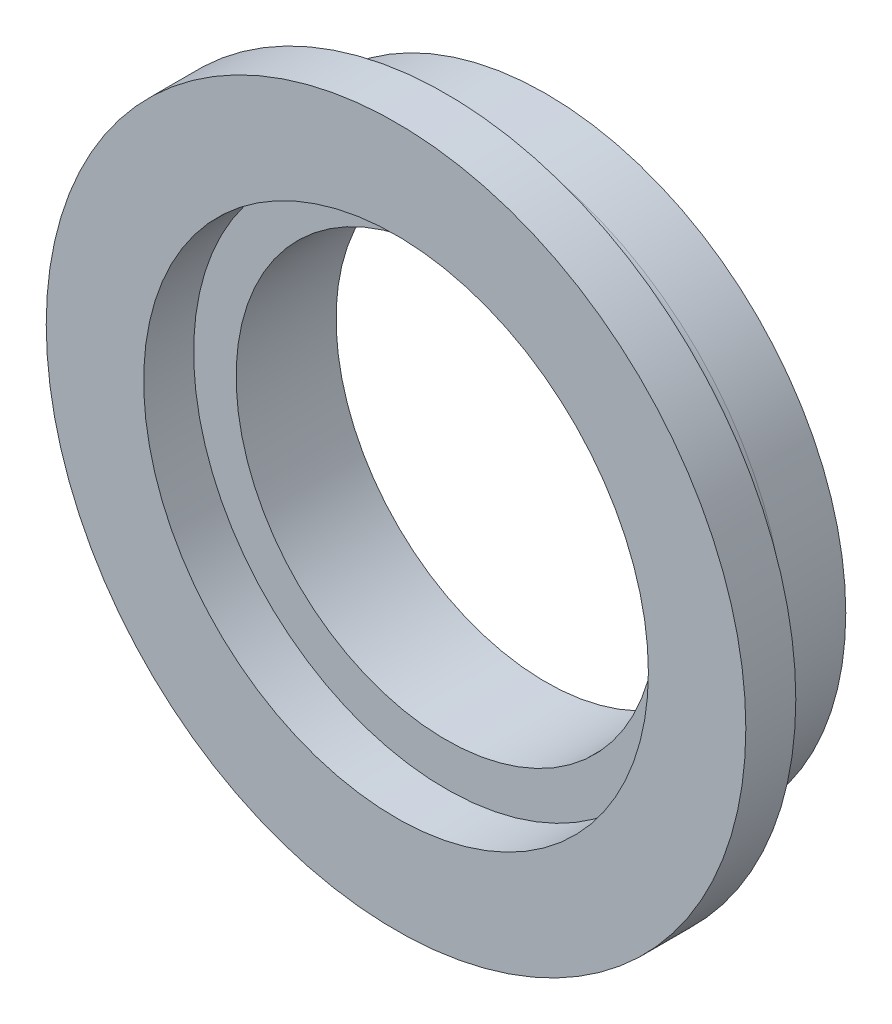
ISO-10303-21;
HEADER;
FILE_DESCRIPTION(('STEP AP214'),'2;1');
FILE_NAME('part.step','',(''),(''),'','','');
FILE_SCHEMA(('AUTOMOTIVE_DESIGN { 1 0 10303 214 1 1 1 1 }'));
ENDSEC;
DATA;
#1=APPLICATION_CONTEXT('core data for automotive mechanical design processes');
#2=APPLICATION_PROTOCOL_DEFINITION('international standard','automotive_design',2000,#1);
#3=PRODUCT_CONTEXT('',#1,'mechanical');
#4=PRODUCT('Part','Part','',(#3));
#5=PRODUCT_RELATED_PRODUCT_CATEGORY('part','',(#4));
#6=PRODUCT_DEFINITION_FORMATION('','',#4);
#7=PRODUCT_DEFINITION_CONTEXT('part definition',#1,'design');
#8=PRODUCT_DEFINITION('design','',#6,#7);
#9=PRODUCT_DEFINITION_SHAPE('','',#8);
#10=(LENGTH_UNIT() NAMED_UNIT(*) SI_UNIT(.MILLI.,.METRE.));
#11=(NAMED_UNIT(*) PLANE_ANGLE_UNIT() SI_UNIT($,.RADIAN.));
#12=(NAMED_UNIT(*) SI_UNIT($,.STERADIAN.) SOLID_ANGLE_UNIT());
#13=UNCERTAINTY_MEASURE_WITH_UNIT(LENGTH_MEASURE(1.E-05),#10,'distance_accuracy_value','');
#14=(GEOMETRIC_REPRESENTATION_CONTEXT(3) GLOBAL_UNCERTAINTY_ASSIGNED_CONTEXT((#13)) GLOBAL_UNIT_ASSIGNED_CONTEXT((#10,
#11,#12)) REPRESENTATION_CONTEXT('',''));
#15=CARTESIAN_POINT('',(0.,0.,0.));
#16=DIRECTION('',(0.,0.,1.));
#17=DIRECTION('',(1.,0.,0.));
#18=AXIS2_PLACEMENT_3D('',#15,#16,#17);
#19=CARTESIAN_POINT('',(0.,0.,3.175));
#20=DIRECTION('',(0.,0.,1.));
#21=DIRECTION('',(1.,0.,0.));
#22=AXIS2_PLACEMENT_3D('',#19,#20,#21);
#23=PLANE('',#22);
#24=CARTESIAN_POINT('',(0.,0.,3.175));
#25=DIRECTION('',(0.,0.,1.));
#26=DIRECTION('',(1.,0.,0.));
#27=AXIS2_PLACEMENT_3D('',#24,#25,#26);
#28=CIRCLE('',#27,13.335);
#29=CARTESIAN_POINT('',(13.335,0.,3.175));
#30=VERTEX_POINT('',#29);
#31=EDGE_CURVE('E46',#30,#30,#28,.T.);
#32=ORIENTED_EDGE('',*,*,#31,.F.);
#33=EDGE_LOOP('',(#32));
#34=FACE_BOUND('',#33,.T.);
#35=CARTESIAN_POINT('',(0.,0.,3.175));
#36=DIRECTION('',(0.,0.,1.));
#37=DIRECTION('',(1.,0.,0.));
#38=AXIS2_PLACEMENT_3D('',#35,#36,#37);
#39=CIRCLE('',#38,16.03375);
#40=CARTESIAN_POINT('',(16.03375,0.,3.175));
#41=VERTEX_POINT('',#40);
#42=EDGE_CURVE('E61',#41,#41,#39,.T.);
#43=ORIENTED_EDGE('',*,*,#42,.T.);
#44=EDGE_LOOP('',(#43));
#45=FACE_BOUND('',#44,.T.);
#46=ADVANCED_FACE('F31',(#34,#45),#23,.T.);
#47=CARTESIAN_POINT('',(0.,0.,-3.175));
#48=DIRECTION('',(0.,0.,1.));
#49=DIRECTION('',(1.,0.,0.));
#50=AXIS2_PLACEMENT_3D('',#47,#48,#49);
#51=PLANE('',#50);
#52=CARTESIAN_POINT('',(0.,0.,-3.175));
#53=DIRECTION('',(0.,0.,1.));
#54=DIRECTION('',(1.,0.,0.));
#55=AXIS2_PLACEMENT_3D('',#52,#53,#54);
#56=CIRCLE('',#55,19.05);
#57=CARTESIAN_POINT('',(19.05,0.,-3.175));
#58=VERTEX_POINT('',#57);
#59=EDGE_CURVE('E42',#58,#58,#56,.T.);
#60=ORIENTED_EDGE('',*,*,#59,.F.);
#61=EDGE_LOOP('',(#60));
#62=FACE_BOUND('',#61,.T.);
#63=CARTESIAN_POINT('',(0.,0.,-3.175));
#64=DIRECTION('',(0.,0.,1.));
#65=DIRECTION('',(1.,0.,0.));
#66=AXIS2_PLACEMENT_3D('',#63,#64,#65);
#67=CIRCLE('',#66,13.335);
#68=CARTESIAN_POINT('',(13.335,0.,-3.175));
#69=VERTEX_POINT('',#68);
#70=EDGE_CURVE('E49',#69,#69,#67,.T.);
#71=ORIENTED_EDGE('',*,*,#70,.T.);
#72=EDGE_LOOP('',(#71));
#73=FACE_BOUND('',#72,.T.);
#74=ADVANCED_FACE('F86',(#62,#73),#51,.F.);
#75=CARTESIAN_POINT('',(0.,0.,3.175));
#76=DIRECTION('',(0.,0.,-1.));
#77=DIRECTION('',(-1.,0.,0.));
#78=AXIS2_PLACEMENT_3D('',#75,#76,#77);
#79=CYLINDRICAL_SURFACE('',#78,19.05);
#80=CARTESIAN_POINT('',(0.,0.,0.635));
#81=DIRECTION('',(0.,0.,1.));
#82=DIRECTION('',(1.,0.,0.));
#83=AXIS2_PLACEMENT_3D('',#80,#81,#82);
#84=CIRCLE('',#83,19.05);
#85=CARTESIAN_POINT('',(19.05,0.,0.635));
#86=VERTEX_POINT('',#85);
#87=EDGE_CURVE('E10',#86,#86,#84,.F.);
#88=ORIENTED_EDGE('',*,*,#87,.T.);
#89=EDGE_LOOP('',(#88));
#90=FACE_BOUND('',#89,.T.);
#91=ORIENTED_EDGE('',*,*,#59,.T.);
#92=EDGE_LOOP('',(#91));
#93=FACE_BOUND('',#92,.T.);
#94=ADVANCED_FACE('F92',(#90,#93),#79,.T.);
#95=CARTESIAN_POINT('',(0.,0.,3.175));
#96=DIRECTION('',(0.,0.,-1.));
#97=DIRECTION('',(-1.,0.,0.));
#98=AXIS2_PLACEMENT_3D('',#95,#96,#97);
#99=CYLINDRICAL_SURFACE('',#98,13.335);
#100=ORIENTED_EDGE('',*,*,#31,.T.);
#101=EDGE_LOOP('',(#100));
#102=FACE_BOUND('',#101,.T.);
#103=ORIENTED_EDGE('',*,*,#70,.F.);
#104=EDGE_LOOP('',(#103));
#105=FACE_BOUND('',#104,.T.);
#106=ADVANCED_FACE('F82',(#102,#105),#99,.F.);
#107=CARTESIAN_POINT('',(0.,0.,3.175));
#108=DIRECTION('',(0.,0.,1.));
#109=DIRECTION('',(1.,0.,0.));
#110=AXIS2_PLACEMENT_3D('',#107,#108,#109);
#111=PLANE('',#110);
#112=CARTESIAN_POINT('',(0.,0.,3.175));
#113=DIRECTION('',(0.,0.,1.));
#114=DIRECTION('',(1.,0.,0.));
#115=AXIS2_PLACEMENT_3D('',#112,#113,#114);
#116=CIRCLE('',#115,21.59);
#117=CARTESIAN_POINT('',(21.59,0.,3.175));
#118=VERTEX_POINT('',#117);
#119=EDGE_CURVE('E38',#118,#118,#116,.T.);
#120=ORIENTED_EDGE('',*,*,#119,.T.);
#121=EDGE_LOOP('',(#120));
#122=FACE_BOUND('',#121,.T.);
#123=CARTESIAN_POINT('',(0.,0.,3.175));
#124=DIRECTION('',(0.,0.,1.));
#125=DIRECTION('',(1.,0.,0.));
#126=AXIS2_PLACEMENT_3D('',#123,#124,#125);
#127=CIRCLE('',#126,22.225);
#128=CARTESIAN_POINT('',(22.225,0.,3.175));
#129=VERTEX_POINT('',#128);
#130=EDGE_CURVE('E55',#129,#129,#127,.T.);
#131=ORIENTED_EDGE('',*,*,#130,.F.);
#132=EDGE_LOOP('',(#131));
#133=FACE_BOUND('',#132,.T.);
#134=ADVANCED_FACE('F73',(#122,#133),#111,.F.);
#135=CARTESIAN_POINT('',(0.,0.,6.35));
#136=DIRECTION('',(0.,0.,1.));
#137=DIRECTION('',(1.,0.,0.));
#138=AXIS2_PLACEMENT_3D('',#135,#136,#137);
#139=PLANE('',#138);
#140=CARTESIAN_POINT('',(0.,0.,6.35));
#141=DIRECTION('',(0.,0.,1.));
#142=DIRECTION('',(1.,0.,0.));
#143=AXIS2_PLACEMENT_3D('',#140,#141,#142);
#144=CIRCLE('',#143,22.225);
#145=CARTESIAN_POINT('',(22.225,0.,6.35));
#146=VERTEX_POINT('',#145);
#147=EDGE_CURVE('E52',#146,#146,#144,.T.);
#148=ORIENTED_EDGE('',*,*,#147,.T.);
#149=EDGE_LOOP('',(#148));
#150=FACE_BOUND('',#149,.T.);
#151=CARTESIAN_POINT('',(0.,0.,6.35));
#152=DIRECTION('',(0.,0.,1.));
#153=DIRECTION('',(1.,0.,0.));
#154=AXIS2_PLACEMENT_3D('',#151,#152,#153);
#155=CIRCLE('',#154,16.03375);
#156=CARTESIAN_POINT('',(16.03375,0.,6.35));
#157=VERTEX_POINT('',#156);
#158=EDGE_CURVE('E58',#157,#157,#155,.T.);
#159=ORIENTED_EDGE('',*,*,#158,.F.);
#160=EDGE_LOOP('',(#159));
#161=FACE_BOUND('',#160,.T.);
#162=ADVANCED_FACE('F70',(#150,#161),#139,.T.);
#163=CARTESIAN_POINT('',(0.,0.,6.35));
#164=DIRECTION('',(0.,0.,-1.));
#165=DIRECTION('',(-1.,0.,0.));
#166=AXIS2_PLACEMENT_3D('',#163,#164,#165);
#167=CYLINDRICAL_SURFACE('',#166,22.225);
#168=ORIENTED_EDGE('',*,*,#147,.F.);
#169=EDGE_LOOP('',(#168));
#170=FACE_BOUND('',#169,.T.);
#171=ORIENTED_EDGE('',*,*,#130,.T.);
#172=EDGE_LOOP('',(#171));
#173=FACE_BOUND('',#172,.T.);
#174=ADVANCED_FACE('F72',(#170,#173),#167,.T.);
#175=CARTESIAN_POINT('',(0.,0.,6.35));
#176=DIRECTION('',(0.,0.,-1.));
#177=DIRECTION('',(-1.,0.,0.));
#178=AXIS2_PLACEMENT_3D('',#175,#176,#177);
#179=CYLINDRICAL_SURFACE('',#178,16.03375);
#180=ORIENTED_EDGE('',*,*,#158,.T.);
#181=EDGE_LOOP('',(#180));
#182=FACE_BOUND('',#181,.T.);
#183=ORIENTED_EDGE('',*,*,#42,.F.);
#184=EDGE_LOOP('',(#183));
#185=FACE_BOUND('',#184,.T.);
#186=ADVANCED_FACE('F67',(#182,#185),#179,.F.);
#187=CARTESIAN_POINT('',(0.,0.,0.635));
#188=DIRECTION('',(0.,0.,1.));
#189=DIRECTION('',(1.,0.,0.));
#190=AXIS2_PLACEMENT_3D('',#187,#188,#189);
#191=TOROIDAL_SURFACE('',#190,21.59,2.54);
#192=ORIENTED_EDGE('',*,*,#87,.F.);
#193=EDGE_LOOP('',(#192));
#194=FACE_BOUND('',#193,.T.);
#195=ORIENTED_EDGE('',*,*,#119,.F.);
#196=EDGE_LOOP('',(#195));
#197=FACE_BOUND('',#196,.T.);
#198=ADVANCED_FACE('F33',(#194,#197),#191,.F.);
#199=CLOSED_SHELL('',(#46,#74,#94,#106,#134,#162,#174,#186,#198));
#200=MANIFOLD_SOLID_BREP('B2',#199);
#201=ADVANCED_BREP_SHAPE_REPRESENTATION('',(#18,#200),#14);
#202=SHAPE_DEFINITION_REPRESENTATION(#9,#201);
ENDSEC;
END-ISO-10303-21;
